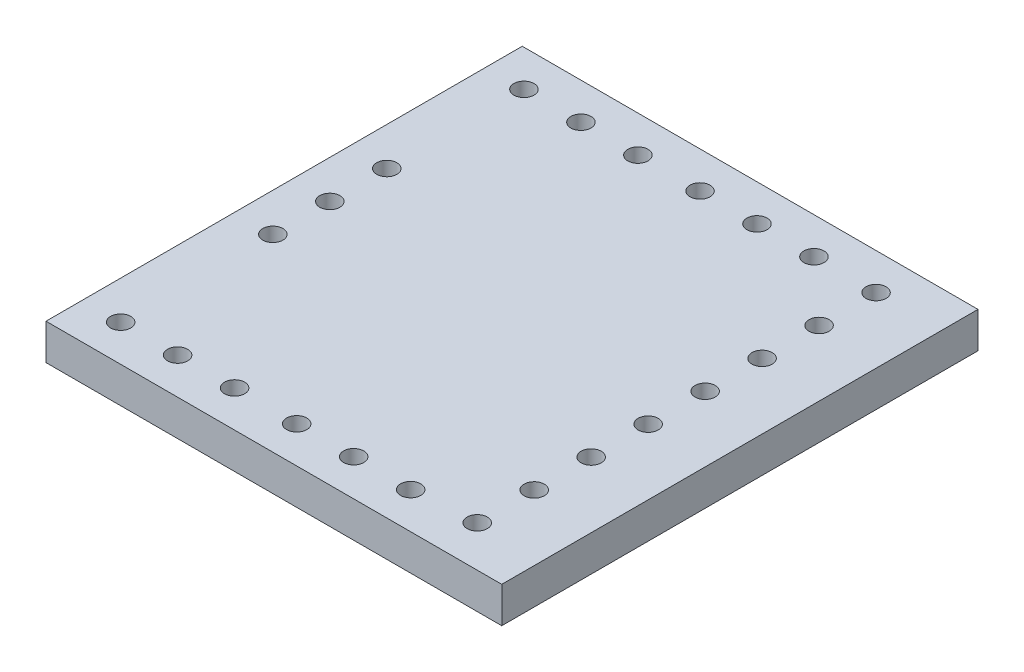
ISO-10303-21;
HEADER;
FILE_DESCRIPTION(('STEP AP214'),'2;1');
FILE_NAME('part.step','',(''),(''),'','','');
FILE_SCHEMA(('AUTOMOTIVE_DESIGN { 1 0 10303 214 1 1 1 1 }'));
ENDSEC;
DATA;
#1=APPLICATION_CONTEXT('core data for automotive mechanical design processes');
#2=APPLICATION_PROTOCOL_DEFINITION('international standard','automotive_design',2000,#1);
#3=PRODUCT_CONTEXT('',#1,'mechanical');
#4=PRODUCT('Part','Part','',(#3));
#5=PRODUCT_RELATED_PRODUCT_CATEGORY('part','',(#4));
#6=PRODUCT_DEFINITION_FORMATION('','',#4);
#7=PRODUCT_DEFINITION_CONTEXT('part definition',#1,'design');
#8=PRODUCT_DEFINITION('design','',#6,#7);
#9=PRODUCT_DEFINITION_SHAPE('','',#8);
#10=(LENGTH_UNIT() NAMED_UNIT(*) SI_UNIT(.MILLI.,.METRE.));
#11=(NAMED_UNIT(*) PLANE_ANGLE_UNIT() SI_UNIT($,.RADIAN.));
#12=(NAMED_UNIT(*) SI_UNIT($,.STERADIAN.) SOLID_ANGLE_UNIT());
#13=UNCERTAINTY_MEASURE_WITH_UNIT(LENGTH_MEASURE(1.E-05),#10,'distance_accuracy_value','');
#14=(GEOMETRIC_REPRESENTATION_CONTEXT(3) GLOBAL_UNCERTAINTY_ASSIGNED_CONTEXT((#13)) GLOBAL_UNIT_ASSIGNED_CONTEXT((#10,
#11,#12)) REPRESENTATION_CONTEXT('',''));
#15=CARTESIAN_POINT('',(0.,0.,0.));
#16=DIRECTION('',(0.,0.,1.));
#17=DIRECTION('',(1.,0.,0.));
#18=AXIS2_PLACEMENT_3D('',#15,#16,#17);
#19=CARTESIAN_POINT('',(10.16,1.6,-10.617));
#20=DIRECTION('',(-1.,0.,0.));
#21=DIRECTION('',(0.,0.,1.));
#22=AXIS2_PLACEMENT_3D('',#19,#20,#21);
#23=PLANE('',#22);
#24=DIRECTION('',(0.,0.,-1.));
#25=VECTOR('',#24,1.);
#26=CARTESIAN_POINT('',(10.16,0.,-10.617));
#27=LINE('',#26,#25);
#28=CARTESIAN_POINT('',(10.16,0.,10.617));
#29=VERTEX_POINT('',#28);
#30=CARTESIAN_POINT('',(10.16,0.,-10.617));
#31=VERTEX_POINT('',#30);
#32=EDGE_CURVE('E98',#29,#31,#27,.T.);
#33=ORIENTED_EDGE('',*,*,#32,.T.);
#34=DIRECTION('',(0.,-1.,0.));
#35=VECTOR('',#34,1.);
#36=CARTESIAN_POINT('',(10.16,1.6,-10.617));
#37=LINE('',#36,#35);
#38=CARTESIAN_POINT('',(10.16,1.6,-10.617));
#39=VERTEX_POINT('',#38);
#40=EDGE_CURVE('E11',#39,#31,#37,.T.);
#41=ORIENTED_EDGE('',*,*,#40,.F.);
#42=DIRECTION('',(0.,0.,-1.));
#43=VECTOR('',#42,1.);
#44=CARTESIAN_POINT('',(10.16,1.6,-10.617));
#45=LINE('',#44,#43);
#46=CARTESIAN_POINT('',(10.16,1.6,10.617));
#47=VERTEX_POINT('',#46);
#48=EDGE_CURVE('E86',#47,#39,#45,.T.);
#49=ORIENTED_EDGE('',*,*,#48,.F.);
#50=DIRECTION('',(0.,-1.,0.));
#51=VECTOR('',#50,1.);
#52=CARTESIAN_POINT('',(10.16,1.6,10.617));
#53=LINE('',#52,#51);
#54=EDGE_CURVE('E94',#47,#29,#53,.T.);
#55=ORIENTED_EDGE('',*,*,#54,.T.);
#56=EDGE_LOOP('',(#33,#41,#49,#55));
#57=FACE_BOUND('',#56,.T.);
#58=ADVANCED_FACE('F35',(#57),#23,.F.);
#59=CARTESIAN_POINT('',(-10.16,1.6,-10.617));
#60=DIRECTION('',(0.,0.,1.));
#61=DIRECTION('',(1.,0.,0.));
#62=AXIS2_PLACEMENT_3D('',#59,#60,#61);
#63=PLANE('',#62);
#64=DIRECTION('',(-1.,0.,0.));
#65=VECTOR('',#64,1.);
#66=CARTESIAN_POINT('',(-10.16,0.,-10.617));
#67=LINE('',#66,#65);
#68=CARTESIAN_POINT('',(-10.16,0.,-10.617));
#69=VERTEX_POINT('',#68);
#70=EDGE_CURVE('E90',#31,#69,#67,.T.);
#71=ORIENTED_EDGE('',*,*,#70,.T.);
#72=DIRECTION('',(0.,-1.,0.));
#73=VECTOR('',#72,1.);
#74=CARTESIAN_POINT('',(-10.16,1.6,-10.617));
#75=LINE('',#74,#73);
#76=CARTESIAN_POINT('',(-10.16,1.6,-10.617));
#77=VERTEX_POINT('',#76);
#78=EDGE_CURVE('E43',#77,#69,#75,.T.);
#79=ORIENTED_EDGE('',*,*,#78,.F.);
#80=DIRECTION('',(-1.,0.,0.));
#81=VECTOR('',#80,1.);
#82=CARTESIAN_POINT('',(-10.16,1.6,-10.617));
#83=LINE('',#82,#81);
#84=EDGE_CURVE('E81',#39,#77,#83,.T.);
#85=ORIENTED_EDGE('',*,*,#84,.F.);
#86=ORIENTED_EDGE('',*,*,#40,.T.);
#87=EDGE_LOOP('',(#71,#79,#85,#86));
#88=FACE_BOUND('',#87,.T.);
#89=ADVANCED_FACE('F89',(#88),#63,.F.);
#90=CARTESIAN_POINT('',(-10.16,1.6,-10.617));
#91=DIRECTION('',(1.,0.,0.));
#92=DIRECTION('',(0.,0.,-1.));
#93=AXIS2_PLACEMENT_3D('',#90,#91,#92);
#94=PLANE('',#93);
#95=DIRECTION('',(0.,0.,1.));
#96=VECTOR('',#95,1.);
#97=CARTESIAN_POINT('',(-10.16,0.,-10.617));
#98=LINE('',#97,#96);
#99=CARTESIAN_POINT('',(-10.16,0.,10.617));
#100=VERTEX_POINT('',#99);
#101=EDGE_CURVE('E68',#69,#100,#98,.T.);
#102=ORIENTED_EDGE('',*,*,#101,.T.);
#103=DIRECTION('',(0.,-1.,0.));
#104=VECTOR('',#103,1.);
#105=CARTESIAN_POINT('',(-10.16,1.6,10.617));
#106=LINE('',#105,#104);
#107=CARTESIAN_POINT('',(-10.16,1.6,10.617));
#108=VERTEX_POINT('',#107);
#109=EDGE_CURVE('E91',#108,#100,#106,.T.);
#110=ORIENTED_EDGE('',*,*,#109,.F.);
#111=DIRECTION('',(0.,0.,1.));
#112=VECTOR('',#111,1.);
#113=CARTESIAN_POINT('',(-10.16,1.6,-10.617));
#114=LINE('',#113,#112);
#115=EDGE_CURVE('E84',#77,#108,#114,.T.);
#116=ORIENTED_EDGE('',*,*,#115,.F.);
#117=ORIENTED_EDGE('',*,*,#78,.T.);
#118=EDGE_LOOP('',(#102,#110,#116,#117));
#119=FACE_BOUND('',#118,.T.);
#120=ADVANCED_FACE('F92',(#119),#94,.F.);
#121=CARTESIAN_POINT('',(-10.16,1.6,10.617));
#122=DIRECTION('',(0.,0.,-1.));
#123=DIRECTION('',(-1.,0.,0.));
#124=AXIS2_PLACEMENT_3D('',#121,#122,#123);
#125=PLANE('',#124);
#126=DIRECTION('',(1.,0.,0.));
#127=VECTOR('',#126,1.);
#128=CARTESIAN_POINT('',(-10.16,0.,10.617));
#129=LINE('',#128,#127);
#130=EDGE_CURVE('E74',#100,#29,#129,.T.);
#131=ORIENTED_EDGE('',*,*,#130,.T.);
#132=ORIENTED_EDGE('',*,*,#54,.F.);
#133=DIRECTION('',(1.,0.,0.));
#134=VECTOR('',#133,1.);
#135=CARTESIAN_POINT('',(-10.16,1.6,10.617));
#136=LINE('',#135,#134);
#137=EDGE_CURVE('E51',#108,#47,#136,.T.);
#138=ORIENTED_EDGE('',*,*,#137,.F.);
#139=ORIENTED_EDGE('',*,*,#109,.T.);
#140=EDGE_LOOP('',(#131,#132,#138,#139));
#141=FACE_BOUND('',#140,.T.);
#142=ADVANCED_FACE('F106',(#141),#125,.F.);
#143=CARTESIAN_POINT('',(0.,1.6,0.));
#144=DIRECTION('',(0.,1.,0.));
#145=DIRECTION('',(0.,0.,1.));
#146=AXIS2_PLACEMENT_3D('',#143,#144,#145);
#147=PLANE('',#146);
#148=CARTESIAN_POINT('',(-8.45699999999997,1.6,2.20500000000003));
#149=DIRECTION('',(0.,1.,0.));
#150=DIRECTION('',(0.,0.,1.));
#151=AXIS2_PLACEMENT_3D('',#148,#149,#150);
#152=CIRCLE('',#151,0.45);
#153=CARTESIAN_POINT('',(-8.45699999999997,1.6,2.65500000000003));
#154=VERTEX_POINT('',#153);
#155=EDGE_CURVE('E244',#154,#154,#152,.T.);
#156=ORIENTED_EDGE('',*,*,#155,.F.);
#157=EDGE_LOOP('',(#156));
#158=FACE_BOUND('',#157,.T.);
#159=CARTESIAN_POINT('',(-8.45699999999997,1.6,-0.334999999999974));
#160=DIRECTION('',(0.,1.,0.));
#161=DIRECTION('',(0.,0.,1.));
#162=AXIS2_PLACEMENT_3D('',#159,#160,#161);
#163=CIRCLE('',#162,0.45);
#164=CARTESIAN_POINT('',(-8.45699999999997,1.6,0.115000000000026));
#165=VERTEX_POINT('',#164);
#166=EDGE_CURVE('E238',#165,#165,#163,.T.);
#167=ORIENTED_EDGE('',*,*,#166,.F.);
#168=EDGE_LOOP('',(#167));
#169=FACE_BOUND('',#168,.T.);
#170=CARTESIAN_POINT('',(-8.45699999999997,1.6,-2.87499999999997));
#171=DIRECTION('',(0.,1.,0.));
#172=DIRECTION('',(0.,0.,1.));
#173=AXIS2_PLACEMENT_3D('',#170,#171,#172);
#174=CIRCLE('',#173,0.45);
#175=CARTESIAN_POINT('',(-8.45699999999997,1.6,-2.42499999999997));
#176=VERTEX_POINT('',#175);
#177=EDGE_CURVE('E232',#176,#176,#174,.T.);
#178=ORIENTED_EDGE('',*,*,#177,.F.);
#179=EDGE_LOOP('',(#178));
#180=FACE_BOUND('',#179,.T.);
#181=CARTESIAN_POINT('',(7.23900000000004,1.6,8.78900000000002));
#182=DIRECTION('',(0.,1.,0.));
#183=DIRECTION('',(0.,0.,1.));
#184=AXIS2_PLACEMENT_3D('',#181,#182,#183);
#185=CIRCLE('',#184,0.450000000000001);
#186=CARTESIAN_POINT('',(7.23900000000004,1.6,9.23900000000002));
#187=VERTEX_POINT('',#186);
#188=EDGE_CURVE('E226',#187,#187,#185,.T.);
#189=ORIENTED_EDGE('',*,*,#188,.F.);
#190=EDGE_LOOP('',(#189));
#191=FACE_BOUND('',#190,.T.);
#192=CARTESIAN_POINT('',(7.23900000000004,1.6,6.24900000000002));
#193=DIRECTION('',(0.,1.,0.));
#194=DIRECTION('',(0.,0.,1.));
#195=AXIS2_PLACEMENT_3D('',#192,#193,#194);
#196=CIRCLE('',#195,0.450000000000001);
#197=CARTESIAN_POINT('',(7.23900000000004,1.6,6.69900000000002));
#198=VERTEX_POINT('',#197);
#199=EDGE_CURVE('E220',#198,#198,#196,.T.);
#200=ORIENTED_EDGE('',*,*,#199,.F.);
#201=EDGE_LOOP('',(#200));
#202=FACE_BOUND('',#201,.T.);
#203=CARTESIAN_POINT('',(7.23900000000004,1.6,3.70900000000002));
#204=DIRECTION('',(0.,1.,0.));
#205=DIRECTION('',(0.,0.,1.));
#206=AXIS2_PLACEMENT_3D('',#203,#204,#205);
#207=CIRCLE('',#206,0.450000000000001);
#208=CARTESIAN_POINT('',(7.23900000000004,1.6,4.15900000000003));
#209=VERTEX_POINT('',#208);
#210=EDGE_CURVE('E214',#209,#209,#207,.T.);
#211=ORIENTED_EDGE('',*,*,#210,.F.);
#212=EDGE_LOOP('',(#211));
#213=FACE_BOUND('',#212,.T.);
#214=CARTESIAN_POINT('',(7.23900000000004,1.6,1.16900000000002));
#215=DIRECTION('',(0.,1.,0.));
#216=DIRECTION('',(0.,0.,1.));
#217=AXIS2_PLACEMENT_3D('',#214,#215,#216);
#218=CIRCLE('',#217,0.450000000000001);
#219=CARTESIAN_POINT('',(7.23900000000004,1.6,1.61900000000003));
#220=VERTEX_POINT('',#219);
#221=EDGE_CURVE('E208',#220,#220,#218,.T.);
#222=ORIENTED_EDGE('',*,*,#221,.F.);
#223=EDGE_LOOP('',(#222));
#224=FACE_BOUND('',#223,.T.);
#225=CARTESIAN_POINT('',(7.23900000000003,1.6,-1.37099999999998));
#226=DIRECTION('',(0.,1.,0.));
#227=DIRECTION('',(0.,0.,1.));
#228=AXIS2_PLACEMENT_3D('',#225,#226,#227);
#229=CIRCLE('',#228,0.450000000000001);
#230=CARTESIAN_POINT('',(7.23900000000003,1.6,-0.920999999999974));
#231=VERTEX_POINT('',#230);
#232=EDGE_CURVE('E202',#231,#231,#229,.T.);
#233=ORIENTED_EDGE('',*,*,#232,.F.);
#234=EDGE_LOOP('',(#233));
#235=FACE_BOUND('',#234,.T.);
#236=CARTESIAN_POINT('',(7.23900000000003,1.6,-3.91099999999998));
#237=DIRECTION('',(0.,1.,0.));
#238=DIRECTION('',(0.,0.,1.));
#239=AXIS2_PLACEMENT_3D('',#236,#237,#238);
#240=CIRCLE('',#239,0.450000000000001);
#241=CARTESIAN_POINT('',(7.23900000000003,1.6,-3.46099999999997));
#242=VERTEX_POINT('',#241);
#243=EDGE_CURVE('E196',#242,#242,#240,.T.);
#244=ORIENTED_EDGE('',*,*,#243,.F.);
#245=EDGE_LOOP('',(#244));
#246=FACE_BOUND('',#245,.T.);
#247=CARTESIAN_POINT('',(7.23900000000003,1.6,-6.45099999999997));
#248=DIRECTION('',(0.,1.,0.));
#249=DIRECTION('',(0.,0.,1.));
#250=AXIS2_PLACEMENT_3D('',#247,#248,#249);
#251=CIRCLE('',#250,0.450000000000001);
#252=CARTESIAN_POINT('',(7.23900000000003,1.6,-6.00099999999997));
#253=VERTEX_POINT('',#252);
#254=EDGE_CURVE('E190',#253,#253,#251,.T.);
#255=ORIENTED_EDGE('',*,*,#254,.F.);
#256=EDGE_LOOP('',(#255));
#257=FACE_BOUND('',#256,.T.);
#258=CARTESIAN_POINT('',(7.23900000000003,1.6,-8.99099999999997));
#259=DIRECTION('',(0.,1.,0.));
#260=DIRECTION('',(0.,0.,1.));
#261=AXIS2_PLACEMENT_3D('',#258,#259,#260);
#262=CIRCLE('',#261,0.450000000000001);
#263=CARTESIAN_POINT('',(7.23900000000003,1.6,-8.54099999999997));
#264=VERTEX_POINT('',#263);
#265=EDGE_CURVE('E184',#264,#264,#262,.T.);
#266=ORIENTED_EDGE('',*,*,#265,.F.);
#267=EDGE_LOOP('',(#266));
#268=FACE_BOUND('',#267,.T.);
#269=CARTESIAN_POINT('',(-8.45799999999997,1.6,8.99099999999997));
#270=DIRECTION('',(0.,1.,0.));
#271=DIRECTION('',(0.,0.,-1.));
#272=AXIS2_PLACEMENT_3D('',#269,#270,#271);
#273=CIRCLE('',#272,0.45);
#274=CARTESIAN_POINT('',(-8.45799999999997,1.6,8.54099999999997));
#275=VERTEX_POINT('',#274);
#276=EDGE_CURVE('E178',#275,#275,#273,.T.);
#277=ORIENTED_EDGE('',*,*,#276,.F.);
#278=EDGE_LOOP('',(#277));
#279=FACE_BOUND('',#278,.T.);
#280=CARTESIAN_POINT('',(-5.91799999999997,1.6,8.99099999999997));
#281=DIRECTION('',(0.,1.,0.));
#282=DIRECTION('',(0.,0.,-1.));
#283=AXIS2_PLACEMENT_3D('',#280,#281,#282);
#284=CIRCLE('',#283,0.45);
#285=CARTESIAN_POINT('',(-5.91799999999997,1.6,8.54099999999997));
#286=VERTEX_POINT('',#285);
#287=EDGE_CURVE('E172',#286,#286,#284,.T.);
#288=ORIENTED_EDGE('',*,*,#287,.F.);
#289=EDGE_LOOP('',(#288));
#290=FACE_BOUND('',#289,.T.);
#291=CARTESIAN_POINT('',(-3.37799999999997,1.6,8.99099999999997));
#292=DIRECTION('',(0.,1.,0.));
#293=DIRECTION('',(0.,0.,-1.));
#294=AXIS2_PLACEMENT_3D('',#291,#292,#293);
#295=CIRCLE('',#294,0.45);
#296=CARTESIAN_POINT('',(-3.37799999999997,1.6,8.54099999999997));
#297=VERTEX_POINT('',#296);
#298=EDGE_CURVE('E166',#297,#297,#295,.T.);
#299=ORIENTED_EDGE('',*,*,#298,.F.);
#300=EDGE_LOOP('',(#299));
#301=FACE_BOUND('',#300,.T.);
#302=CARTESIAN_POINT('',(-0.607999999999971,1.6,8.99099999999997));
#303=DIRECTION('',(0.,1.,0.));
#304=DIRECTION('',(0.,0.,-1.));
#305=AXIS2_PLACEMENT_3D('',#302,#303,#304);
#306=CIRCLE('',#305,0.45);
#307=CARTESIAN_POINT('',(-0.607999999999971,1.6,8.54099999999997));
#308=VERTEX_POINT('',#307);
#309=EDGE_CURVE('E160',#308,#308,#306,.T.);
#310=ORIENTED_EDGE('',*,*,#309,.F.);
#311=EDGE_LOOP('',(#310));
#312=FACE_BOUND('',#311,.T.);
#313=CARTESIAN_POINT('',(1.93200000000003,1.6,8.99099999999997));
#314=DIRECTION('',(0.,1.,0.));
#315=DIRECTION('',(0.,0.,-1.));
#316=AXIS2_PLACEMENT_3D('',#313,#314,#315);
#317=CIRCLE('',#316,0.45);
#318=CARTESIAN_POINT('',(1.93200000000003,1.6,8.54099999999997));
#319=VERTEX_POINT('',#318);
#320=EDGE_CURVE('E154',#319,#319,#317,.T.);
#321=ORIENTED_EDGE('',*,*,#320,.F.);
#322=EDGE_LOOP('',(#321));
#323=FACE_BOUND('',#322,.T.);
#324=CARTESIAN_POINT('',(4.47200000000003,1.6,8.99099999999997));
#325=DIRECTION('',(0.,1.,0.));
#326=DIRECTION('',(0.,0.,-1.));
#327=AXIS2_PLACEMENT_3D('',#324,#325,#326);
#328=CIRCLE('',#327,0.45);
#329=CARTESIAN_POINT('',(4.47200000000003,1.6,8.54099999999997));
#330=VERTEX_POINT('',#329);
#331=EDGE_CURVE('E148',#330,#330,#328,.T.);
#332=ORIENTED_EDGE('',*,*,#331,.F.);
#333=EDGE_LOOP('',(#332));
#334=FACE_BOUND('',#333,.T.);
#335=CARTESIAN_POINT('',(4.47200000000003,1.6,-8.99099999999997));
#336=DIRECTION('',(0.,1.,0.));
#337=DIRECTION('',(0.,0.,1.));
#338=AXIS2_PLACEMENT_3D('',#335,#336,#337);
#339=CIRCLE('',#338,0.45);
#340=CARTESIAN_POINT('',(4.47200000000003,1.6,-8.54099999999997));
#341=VERTEX_POINT('',#340);
#342=EDGE_CURVE('E142',#341,#341,#339,.T.);
#343=ORIENTED_EDGE('',*,*,#342,.F.);
#344=EDGE_LOOP('',(#343));
#345=FACE_BOUND('',#344,.T.);
#346=CARTESIAN_POINT('',(1.93200000000003,1.6,-8.99099999999997));
#347=DIRECTION('',(0.,1.,0.));
#348=DIRECTION('',(0.,0.,1.));
#349=AXIS2_PLACEMENT_3D('',#346,#347,#348);
#350=CIRCLE('',#349,0.45);
#351=CARTESIAN_POINT('',(1.93200000000003,1.6,-8.54099999999997));
#352=VERTEX_POINT('',#351);
#353=EDGE_CURVE('E136',#352,#352,#350,.T.);
#354=ORIENTED_EDGE('',*,*,#353,.F.);
#355=EDGE_LOOP('',(#354));
#356=FACE_BOUND('',#355,.T.);
#357=CARTESIAN_POINT('',(-0.607999999999971,1.6,-8.99099999999997));
#358=DIRECTION('',(0.,1.,0.));
#359=DIRECTION('',(0.,0.,1.));
#360=AXIS2_PLACEMENT_3D('',#357,#358,#359);
#361=CIRCLE('',#360,0.45);
#362=CARTESIAN_POINT('',(-0.607999999999971,1.6,-8.54099999999997));
#363=VERTEX_POINT('',#362);
#364=EDGE_CURVE('E130',#363,#363,#361,.T.);
#365=ORIENTED_EDGE('',*,*,#364,.F.);
#366=EDGE_LOOP('',(#365));
#367=FACE_BOUND('',#366,.T.);
#368=CARTESIAN_POINT('',(-3.37799999999997,1.6,-8.99099999999997));
#369=DIRECTION('',(0.,1.,0.));
#370=DIRECTION('',(0.,0.,1.));
#371=AXIS2_PLACEMENT_3D('',#368,#369,#370);
#372=CIRCLE('',#371,0.45);
#373=CARTESIAN_POINT('',(-3.37799999999997,1.6,-8.54099999999997));
#374=VERTEX_POINT('',#373);
#375=EDGE_CURVE('E124',#374,#374,#372,.T.);
#376=ORIENTED_EDGE('',*,*,#375,.F.);
#377=EDGE_LOOP('',(#376));
#378=FACE_BOUND('',#377,.T.);
#379=CARTESIAN_POINT('',(-5.91799999999997,1.6,-8.99099999999997));
#380=DIRECTION('',(0.,1.,0.));
#381=DIRECTION('',(0.,0.,1.));
#382=AXIS2_PLACEMENT_3D('',#379,#380,#381);
#383=CIRCLE('',#382,0.45);
#384=CARTESIAN_POINT('',(-5.91799999999997,1.6,-8.54099999999997));
#385=VERTEX_POINT('',#384);
#386=EDGE_CURVE('E118',#385,#385,#383,.T.);
#387=ORIENTED_EDGE('',*,*,#386,.F.);
#388=EDGE_LOOP('',(#387));
#389=FACE_BOUND('',#388,.T.);
#390=CARTESIAN_POINT('',(-8.45799999999997,1.6,-8.99099999999997));
#391=DIRECTION('',(0.,1.,0.));
#392=DIRECTION('',(0.,0.,1.));
#393=AXIS2_PLACEMENT_3D('',#390,#391,#392);
#394=CIRCLE('',#393,0.45);
#395=CARTESIAN_POINT('',(-8.45799999999997,1.6,-8.54099999999997));
#396=VERTEX_POINT('',#395);
#397=EDGE_CURVE('E112',#396,#396,#394,.T.);
#398=ORIENTED_EDGE('',*,*,#397,.F.);
#399=EDGE_LOOP('',(#398));
#400=FACE_BOUND('',#399,.T.);
#401=ORIENTED_EDGE('',*,*,#48,.T.);
#402=ORIENTED_EDGE('',*,*,#84,.T.);
#403=ORIENTED_EDGE('',*,*,#115,.T.);
#404=ORIENTED_EDGE('',*,*,#137,.T.);
#405=EDGE_LOOP('',(#401,#402,#403,#404));
#406=FACE_BOUND('',#405,.T.);
#407=ADVANCED_FACE('F82',(#158,#169,#180,#191,#202,#213,#224,#235,#246,#257,#268,#279,#290,#301,
#312,#323,#334,#345,#356,#367,#378,#389,#400,#406),#147,.T.);
#408=CARTESIAN_POINT('',(0.,0.,0.));
#409=DIRECTION('',(0.,1.,0.));
#410=DIRECTION('',(0.,0.,1.));
#411=AXIS2_PLACEMENT_3D('',#408,#409,#410);
#412=PLANE('',#411);
#413=CARTESIAN_POINT('',(-8.45699999999997,0.,2.20500000000003));
#414=DIRECTION('',(0.,1.,0.));
#415=DIRECTION('',(0.,0.,1.));
#416=AXIS2_PLACEMENT_3D('',#413,#414,#415);
#417=CIRCLE('',#416,0.45);
#418=CARTESIAN_POINT('',(-8.45699999999997,0.,2.65500000000003));
#419=VERTEX_POINT('',#418);
#420=EDGE_CURVE('E241',#419,#419,#417,.T.);
#421=ORIENTED_EDGE('',*,*,#420,.T.);
#422=EDGE_LOOP('',(#421));
#423=FACE_BOUND('',#422,.T.);
#424=CARTESIAN_POINT('',(-8.45699999999997,0.,-0.334999999999974));
#425=DIRECTION('',(0.,1.,0.));
#426=DIRECTION('',(0.,0.,1.));
#427=AXIS2_PLACEMENT_3D('',#424,#425,#426);
#428=CIRCLE('',#427,0.45);
#429=CARTESIAN_POINT('',(-8.45699999999997,0.,0.115000000000026));
#430=VERTEX_POINT('',#429);
#431=EDGE_CURVE('E235',#430,#430,#428,.T.);
#432=ORIENTED_EDGE('',*,*,#431,.T.);
#433=EDGE_LOOP('',(#432));
#434=FACE_BOUND('',#433,.T.);
#435=CARTESIAN_POINT('',(-8.45699999999997,0.,-2.87499999999997));
#436=DIRECTION('',(0.,1.,0.));
#437=DIRECTION('',(0.,0.,1.));
#438=AXIS2_PLACEMENT_3D('',#435,#436,#437);
#439=CIRCLE('',#438,0.45);
#440=CARTESIAN_POINT('',(-8.45699999999997,0.,-2.42499999999997));
#441=VERTEX_POINT('',#440);
#442=EDGE_CURVE('E229',#441,#441,#439,.T.);
#443=ORIENTED_EDGE('',*,*,#442,.T.);
#444=EDGE_LOOP('',(#443));
#445=FACE_BOUND('',#444,.T.);
#446=CARTESIAN_POINT('',(7.23900000000004,0.,8.78900000000002));
#447=DIRECTION('',(0.,1.,0.));
#448=DIRECTION('',(0.,0.,1.));
#449=AXIS2_PLACEMENT_3D('',#446,#447,#448);
#450=CIRCLE('',#449,0.450000000000001);
#451=CARTESIAN_POINT('',(7.23900000000004,0.,9.23900000000002));
#452=VERTEX_POINT('',#451);
#453=EDGE_CURVE('E223',#452,#452,#450,.T.);
#454=ORIENTED_EDGE('',*,*,#453,.T.);
#455=EDGE_LOOP('',(#454));
#456=FACE_BOUND('',#455,.T.);
#457=CARTESIAN_POINT('',(7.23900000000004,0.,6.24900000000002));
#458=DIRECTION('',(0.,1.,0.));
#459=DIRECTION('',(0.,0.,1.));
#460=AXIS2_PLACEMENT_3D('',#457,#458,#459);
#461=CIRCLE('',#460,0.450000000000001);
#462=CARTESIAN_POINT('',(7.23900000000004,0.,6.69900000000002));
#463=VERTEX_POINT('',#462);
#464=EDGE_CURVE('E217',#463,#463,#461,.T.);
#465=ORIENTED_EDGE('',*,*,#464,.T.);
#466=EDGE_LOOP('',(#465));
#467=FACE_BOUND('',#466,.T.);
#468=CARTESIAN_POINT('',(7.23900000000004,0.,3.70900000000002));
#469=DIRECTION('',(0.,1.,0.));
#470=DIRECTION('',(0.,0.,1.));
#471=AXIS2_PLACEMENT_3D('',#468,#469,#470);
#472=CIRCLE('',#471,0.450000000000001);
#473=CARTESIAN_POINT('',(7.23900000000004,0.,4.15900000000003));
#474=VERTEX_POINT('',#473);
#475=EDGE_CURVE('E211',#474,#474,#472,.T.);
#476=ORIENTED_EDGE('',*,*,#475,.T.);
#477=EDGE_LOOP('',(#476));
#478=FACE_BOUND('',#477,.T.);
#479=CARTESIAN_POINT('',(7.23900000000004,0.,1.16900000000002));
#480=DIRECTION('',(0.,1.,0.));
#481=DIRECTION('',(0.,0.,1.));
#482=AXIS2_PLACEMENT_3D('',#479,#480,#481);
#483=CIRCLE('',#482,0.450000000000001);
#484=CARTESIAN_POINT('',(7.23900000000004,0.,1.61900000000003));
#485=VERTEX_POINT('',#484);
#486=EDGE_CURVE('E205',#485,#485,#483,.T.);
#487=ORIENTED_EDGE('',*,*,#486,.T.);
#488=EDGE_LOOP('',(#487));
#489=FACE_BOUND('',#488,.T.);
#490=CARTESIAN_POINT('',(7.23900000000003,0.,-1.37099999999998));
#491=DIRECTION('',(0.,1.,0.));
#492=DIRECTION('',(0.,0.,1.));
#493=AXIS2_PLACEMENT_3D('',#490,#491,#492);
#494=CIRCLE('',#493,0.450000000000001);
#495=CARTESIAN_POINT('',(7.23900000000003,0.,-0.920999999999974));
#496=VERTEX_POINT('',#495);
#497=EDGE_CURVE('E199',#496,#496,#494,.T.);
#498=ORIENTED_EDGE('',*,*,#497,.T.);
#499=EDGE_LOOP('',(#498));
#500=FACE_BOUND('',#499,.T.);
#501=CARTESIAN_POINT('',(7.23900000000003,0.,-3.91099999999998));
#502=DIRECTION('',(0.,1.,0.));
#503=DIRECTION('',(0.,0.,1.));
#504=AXIS2_PLACEMENT_3D('',#501,#502,#503);
#505=CIRCLE('',#504,0.450000000000001);
#506=CARTESIAN_POINT('',(7.23900000000003,0.,-3.46099999999997));
#507=VERTEX_POINT('',#506);
#508=EDGE_CURVE('E193',#507,#507,#505,.T.);
#509=ORIENTED_EDGE('',*,*,#508,.T.);
#510=EDGE_LOOP('',(#509));
#511=FACE_BOUND('',#510,.T.);
#512=CARTESIAN_POINT('',(7.23900000000003,0.,-6.45099999999997));
#513=DIRECTION('',(0.,1.,0.));
#514=DIRECTION('',(0.,0.,1.));
#515=AXIS2_PLACEMENT_3D('',#512,#513,#514);
#516=CIRCLE('',#515,0.450000000000001);
#517=CARTESIAN_POINT('',(7.23900000000003,0.,-6.00099999999997));
#518=VERTEX_POINT('',#517);
#519=EDGE_CURVE('E187',#518,#518,#516,.T.);
#520=ORIENTED_EDGE('',*,*,#519,.T.);
#521=EDGE_LOOP('',(#520));
#522=FACE_BOUND('',#521,.T.);
#523=CARTESIAN_POINT('',(7.23900000000003,0.,-8.99099999999997));
#524=DIRECTION('',(0.,1.,0.));
#525=DIRECTION('',(0.,0.,1.));
#526=AXIS2_PLACEMENT_3D('',#523,#524,#525);
#527=CIRCLE('',#526,0.450000000000001);
#528=CARTESIAN_POINT('',(7.23900000000003,0.,-8.54099999999997));
#529=VERTEX_POINT('',#528);
#530=EDGE_CURVE('E181',#529,#529,#527,.T.);
#531=ORIENTED_EDGE('',*,*,#530,.T.);
#532=EDGE_LOOP('',(#531));
#533=FACE_BOUND('',#532,.T.);
#534=CARTESIAN_POINT('',(-8.45799999999997,0.,8.99099999999997));
#535=DIRECTION('',(0.,1.,0.));
#536=DIRECTION('',(0.,0.,-1.));
#537=AXIS2_PLACEMENT_3D('',#534,#535,#536);
#538=CIRCLE('',#537,0.45);
#539=CARTESIAN_POINT('',(-8.45799999999997,0.,8.54099999999997));
#540=VERTEX_POINT('',#539);
#541=EDGE_CURVE('E175',#540,#540,#538,.T.);
#542=ORIENTED_EDGE('',*,*,#541,.T.);
#543=EDGE_LOOP('',(#542));
#544=FACE_BOUND('',#543,.T.);
#545=CARTESIAN_POINT('',(-5.91799999999997,0.,8.99099999999997));
#546=DIRECTION('',(0.,1.,0.));
#547=DIRECTION('',(0.,0.,-1.));
#548=AXIS2_PLACEMENT_3D('',#545,#546,#547);
#549=CIRCLE('',#548,0.45);
#550=CARTESIAN_POINT('',(-5.91799999999997,0.,8.54099999999997));
#551=VERTEX_POINT('',#550);
#552=EDGE_CURVE('E169',#551,#551,#549,.T.);
#553=ORIENTED_EDGE('',*,*,#552,.T.);
#554=EDGE_LOOP('',(#553));
#555=FACE_BOUND('',#554,.T.);
#556=CARTESIAN_POINT('',(-3.37799999999997,0.,8.99099999999997));
#557=DIRECTION('',(0.,1.,0.));
#558=DIRECTION('',(0.,0.,-1.));
#559=AXIS2_PLACEMENT_3D('',#556,#557,#558);
#560=CIRCLE('',#559,0.45);
#561=CARTESIAN_POINT('',(-3.37799999999997,0.,8.54099999999997));
#562=VERTEX_POINT('',#561);
#563=EDGE_CURVE('E163',#562,#562,#560,.T.);
#564=ORIENTED_EDGE('',*,*,#563,.T.);
#565=EDGE_LOOP('',(#564));
#566=FACE_BOUND('',#565,.T.);
#567=CARTESIAN_POINT('',(-0.607999999999971,0.,8.99099999999997));
#568=DIRECTION('',(0.,1.,0.));
#569=DIRECTION('',(0.,0.,-1.));
#570=AXIS2_PLACEMENT_3D('',#567,#568,#569);
#571=CIRCLE('',#570,0.45);
#572=CARTESIAN_POINT('',(-0.607999999999971,0.,8.54099999999997));
#573=VERTEX_POINT('',#572);
#574=EDGE_CURVE('E157',#573,#573,#571,.T.);
#575=ORIENTED_EDGE('',*,*,#574,.T.);
#576=EDGE_LOOP('',(#575));
#577=FACE_BOUND('',#576,.T.);
#578=CARTESIAN_POINT('',(1.93200000000003,0.,8.99099999999997));
#579=DIRECTION('',(0.,1.,0.));
#580=DIRECTION('',(0.,0.,-1.));
#581=AXIS2_PLACEMENT_3D('',#578,#579,#580);
#582=CIRCLE('',#581,0.45);
#583=CARTESIAN_POINT('',(1.93200000000003,0.,8.54099999999997));
#584=VERTEX_POINT('',#583);
#585=EDGE_CURVE('E151',#584,#584,#582,.T.);
#586=ORIENTED_EDGE('',*,*,#585,.T.);
#587=EDGE_LOOP('',(#586));
#588=FACE_BOUND('',#587,.T.);
#589=CARTESIAN_POINT('',(4.47200000000003,0.,8.99099999999997));
#590=DIRECTION('',(0.,1.,0.));
#591=DIRECTION('',(0.,0.,-1.));
#592=AXIS2_PLACEMENT_3D('',#589,#590,#591);
#593=CIRCLE('',#592,0.45);
#594=CARTESIAN_POINT('',(4.47200000000003,0.,8.54099999999997));
#595=VERTEX_POINT('',#594);
#596=EDGE_CURVE('E145',#595,#595,#593,.T.);
#597=ORIENTED_EDGE('',*,*,#596,.T.);
#598=EDGE_LOOP('',(#597));
#599=FACE_BOUND('',#598,.T.);
#600=CARTESIAN_POINT('',(4.47200000000003,0.,-8.99099999999997));
#601=DIRECTION('',(0.,1.,0.));
#602=DIRECTION('',(0.,0.,1.));
#603=AXIS2_PLACEMENT_3D('',#600,#601,#602);
#604=CIRCLE('',#603,0.45);
#605=CARTESIAN_POINT('',(4.47200000000003,0.,-8.54099999999997));
#606=VERTEX_POINT('',#605);
#607=EDGE_CURVE('E139',#606,#606,#604,.T.);
#608=ORIENTED_EDGE('',*,*,#607,.T.);
#609=EDGE_LOOP('',(#608));
#610=FACE_BOUND('',#609,.T.);
#611=CARTESIAN_POINT('',(1.93200000000003,0.,-8.99099999999997));
#612=DIRECTION('',(0.,1.,0.));
#613=DIRECTION('',(0.,0.,1.));
#614=AXIS2_PLACEMENT_3D('',#611,#612,#613);
#615=CIRCLE('',#614,0.45);
#616=CARTESIAN_POINT('',(1.93200000000003,0.,-8.54099999999997));
#617=VERTEX_POINT('',#616);
#618=EDGE_CURVE('E133',#617,#617,#615,.T.);
#619=ORIENTED_EDGE('',*,*,#618,.T.);
#620=EDGE_LOOP('',(#619));
#621=FACE_BOUND('',#620,.T.);
#622=CARTESIAN_POINT('',(-0.607999999999971,0.,-8.99099999999997));
#623=DIRECTION('',(0.,1.,0.));
#624=DIRECTION('',(0.,0.,1.));
#625=AXIS2_PLACEMENT_3D('',#622,#623,#624);
#626=CIRCLE('',#625,0.45);
#627=CARTESIAN_POINT('',(-0.607999999999971,0.,-8.54099999999997));
#628=VERTEX_POINT('',#627);
#629=EDGE_CURVE('E127',#628,#628,#626,.T.);
#630=ORIENTED_EDGE('',*,*,#629,.T.);
#631=EDGE_LOOP('',(#630));
#632=FACE_BOUND('',#631,.T.);
#633=CARTESIAN_POINT('',(-3.37799999999997,0.,-8.99099999999997));
#634=DIRECTION('',(0.,1.,0.));
#635=DIRECTION('',(0.,0.,1.));
#636=AXIS2_PLACEMENT_3D('',#633,#634,#635);
#637=CIRCLE('',#636,0.45);
#638=CARTESIAN_POINT('',(-3.37799999999997,0.,-8.54099999999997));
#639=VERTEX_POINT('',#638);
#640=EDGE_CURVE('E121',#639,#639,#637,.T.);
#641=ORIENTED_EDGE('',*,*,#640,.T.);
#642=EDGE_LOOP('',(#641));
#643=FACE_BOUND('',#642,.T.);
#644=CARTESIAN_POINT('',(-5.91799999999997,0.,-8.99099999999997));
#645=DIRECTION('',(0.,1.,0.));
#646=DIRECTION('',(0.,0.,1.));
#647=AXIS2_PLACEMENT_3D('',#644,#645,#646);
#648=CIRCLE('',#647,0.45);
#649=CARTESIAN_POINT('',(-5.91799999999997,0.,-8.54099999999997));
#650=VERTEX_POINT('',#649);
#651=EDGE_CURVE('E115',#650,#650,#648,.T.);
#652=ORIENTED_EDGE('',*,*,#651,.T.);
#653=EDGE_LOOP('',(#652));
#654=FACE_BOUND('',#653,.T.);
#655=CARTESIAN_POINT('',(-8.45799999999997,0.,-8.99099999999997));
#656=DIRECTION('',(0.,1.,0.));
#657=DIRECTION('',(0.,0.,1.));
#658=AXIS2_PLACEMENT_3D('',#655,#656,#657);
#659=CIRCLE('',#658,0.45);
#660=CARTESIAN_POINT('',(-8.45799999999997,0.,-8.54099999999997));
#661=VERTEX_POINT('',#660);
#662=EDGE_CURVE('E101',#661,#661,#659,.T.);
#663=ORIENTED_EDGE('',*,*,#662,.T.);
#664=EDGE_LOOP('',(#663));
#665=FACE_BOUND('',#664,.T.);
#666=ORIENTED_EDGE('',*,*,#32,.F.);
#667=ORIENTED_EDGE('',*,*,#130,.F.);
#668=ORIENTED_EDGE('',*,*,#101,.F.);
#669=ORIENTED_EDGE('',*,*,#70,.F.);
#670=EDGE_LOOP('',(#666,#667,#668,#669));
#671=FACE_BOUND('',#670,.T.);
#672=ADVANCED_FACE('F109',(#423,#434,#445,#456,#467,#478,#489,#500,#511,#522,#533,#544,#555,
#566,#577,#588,#599,#610,#621,#632,#643,#654,#665,#671),#412,.F.);
#673=CARTESIAN_POINT('',(-8.45799999999997,0.,-8.99099999999997));
#674=DIRECTION('',(0.,1.,0.));
#675=DIRECTION('',(0.,0.,1.));
#676=AXIS2_PLACEMENT_3D('',#673,#674,#675);
#677=CYLINDRICAL_SURFACE('',#676,0.45);
#678=ORIENTED_EDGE('',*,*,#662,.F.);
#679=EDGE_LOOP('',(#678));
#680=FACE_BOUND('',#679,.T.);
#681=ORIENTED_EDGE('',*,*,#397,.T.);
#682=EDGE_LOOP('',(#681));
#683=FACE_BOUND('',#682,.T.);
#684=ADVANCED_FACE('F306',(#680,#683),#677,.F.);
#685=CARTESIAN_POINT('',(-5.91799999999997,0.,-8.99099999999997));
#686=DIRECTION('',(0.,1.,0.));
#687=DIRECTION('',(0.,0.,1.));
#688=AXIS2_PLACEMENT_3D('',#685,#686,#687);
#689=CYLINDRICAL_SURFACE('',#688,0.45);
#690=ORIENTED_EDGE('',*,*,#651,.F.);
#691=EDGE_LOOP('',(#690));
#692=FACE_BOUND('',#691,.T.);
#693=ORIENTED_EDGE('',*,*,#386,.T.);
#694=EDGE_LOOP('',(#693));
#695=FACE_BOUND('',#694,.T.);
#696=ADVANCED_FACE('F308',(#692,#695),#689,.F.);
#697=CARTESIAN_POINT('',(-3.37799999999997,0.,-8.99099999999997));
#698=DIRECTION('',(0.,1.,0.));
#699=DIRECTION('',(0.,0.,1.));
#700=AXIS2_PLACEMENT_3D('',#697,#698,#699);
#701=CYLINDRICAL_SURFACE('',#700,0.45);
#702=ORIENTED_EDGE('',*,*,#640,.F.);
#703=EDGE_LOOP('',(#702));
#704=FACE_BOUND('',#703,.T.);
#705=ORIENTED_EDGE('',*,*,#375,.T.);
#706=EDGE_LOOP('',(#705));
#707=FACE_BOUND('',#706,.T.);
#708=ADVANCED_FACE('F315',(#704,#707),#701,.F.);
#709=CARTESIAN_POINT('',(-0.607999999999971,0.,-8.99099999999997));
#710=DIRECTION('',(0.,1.,0.));
#711=DIRECTION('',(0.,0.,1.));
#712=AXIS2_PLACEMENT_3D('',#709,#710,#711);
#713=CYLINDRICAL_SURFACE('',#712,0.45);
#714=ORIENTED_EDGE('',*,*,#629,.F.);
#715=EDGE_LOOP('',(#714));
#716=FACE_BOUND('',#715,.T.);
#717=ORIENTED_EDGE('',*,*,#364,.T.);
#718=EDGE_LOOP('',(#717));
#719=FACE_BOUND('',#718,.T.);
#720=ADVANCED_FACE('F363',(#716,#719),#713,.F.);
#721=CARTESIAN_POINT('',(1.93200000000003,0.,-8.99099999999997));
#722=DIRECTION('',(0.,1.,0.));
#723=DIRECTION('',(0.,0.,1.));
#724=AXIS2_PLACEMENT_3D('',#721,#722,#723);
#725=CYLINDRICAL_SURFACE('',#724,0.45);
#726=ORIENTED_EDGE('',*,*,#618,.F.);
#727=EDGE_LOOP('',(#726));
#728=FACE_BOUND('',#727,.T.);
#729=ORIENTED_EDGE('',*,*,#353,.T.);
#730=EDGE_LOOP('',(#729));
#731=FACE_BOUND('',#730,.T.);
#732=ADVANCED_FACE('F373',(#728,#731),#725,.F.);
#733=CARTESIAN_POINT('',(4.47200000000003,0.,-8.99099999999997));
#734=DIRECTION('',(0.,1.,0.));
#735=DIRECTION('',(0.,0.,1.));
#736=AXIS2_PLACEMENT_3D('',#733,#734,#735);
#737=CYLINDRICAL_SURFACE('',#736,0.45);
#738=ORIENTED_EDGE('',*,*,#607,.F.);
#739=EDGE_LOOP('',(#738));
#740=FACE_BOUND('',#739,.T.);
#741=ORIENTED_EDGE('',*,*,#342,.T.);
#742=EDGE_LOOP('',(#741));
#743=FACE_BOUND('',#742,.T.);
#744=ADVANCED_FACE('F383',(#740,#743),#737,.F.);
#745=CARTESIAN_POINT('',(4.47200000000003,0.,8.99099999999997));
#746=DIRECTION('',(0.,1.,0.));
#747=DIRECTION('',(0.,0.,1.));
#748=AXIS2_PLACEMENT_3D('',#745,#746,#747);
#749=CYLINDRICAL_SURFACE('',#748,0.45);
#750=ORIENTED_EDGE('',*,*,#596,.F.);
#751=EDGE_LOOP('',(#750));
#752=FACE_BOUND('',#751,.T.);
#753=ORIENTED_EDGE('',*,*,#331,.T.);
#754=EDGE_LOOP('',(#753));
#755=FACE_BOUND('',#754,.T.);
#756=ADVANCED_FACE('F393',(#752,#755),#749,.F.);
#757=CARTESIAN_POINT('',(1.93200000000003,0.,8.99099999999997));
#758=DIRECTION('',(0.,1.,0.));
#759=DIRECTION('',(0.,0.,1.));
#760=AXIS2_PLACEMENT_3D('',#757,#758,#759);
#761=CYLINDRICAL_SURFACE('',#760,0.45);
#762=ORIENTED_EDGE('',*,*,#585,.F.);
#763=EDGE_LOOP('',(#762));
#764=FACE_BOUND('',#763,.T.);
#765=ORIENTED_EDGE('',*,*,#320,.T.);
#766=EDGE_LOOP('',(#765));
#767=FACE_BOUND('',#766,.T.);
#768=ADVANCED_FACE('F403',(#764,#767),#761,.F.);
#769=CARTESIAN_POINT('',(-0.607999999999971,0.,8.99099999999997));
#770=DIRECTION('',(0.,1.,0.));
#771=DIRECTION('',(0.,0.,1.));
#772=AXIS2_PLACEMENT_3D('',#769,#770,#771);
#773=CYLINDRICAL_SURFACE('',#772,0.45);
#774=ORIENTED_EDGE('',*,*,#574,.F.);
#775=EDGE_LOOP('',(#774));
#776=FACE_BOUND('',#775,.T.);
#777=ORIENTED_EDGE('',*,*,#309,.T.);
#778=EDGE_LOOP('',(#777));
#779=FACE_BOUND('',#778,.T.);
#780=ADVANCED_FACE('F413',(#776,#779),#773,.F.);
#781=CARTESIAN_POINT('',(-3.37799999999997,0.,8.99099999999997));
#782=DIRECTION('',(0.,1.,0.));
#783=DIRECTION('',(0.,0.,1.));
#784=AXIS2_PLACEMENT_3D('',#781,#782,#783);
#785=CYLINDRICAL_SURFACE('',#784,0.45);
#786=ORIENTED_EDGE('',*,*,#563,.F.);
#787=EDGE_LOOP('',(#786));
#788=FACE_BOUND('',#787,.T.);
#789=ORIENTED_EDGE('',*,*,#298,.T.);
#790=EDGE_LOOP('',(#789));
#791=FACE_BOUND('',#790,.T.);
#792=ADVANCED_FACE('F423',(#788,#791),#785,.F.);
#793=CARTESIAN_POINT('',(-5.91799999999997,0.,8.99099999999997));
#794=DIRECTION('',(0.,1.,0.));
#795=DIRECTION('',(0.,0.,1.));
#796=AXIS2_PLACEMENT_3D('',#793,#794,#795);
#797=CYLINDRICAL_SURFACE('',#796,0.45);
#798=ORIENTED_EDGE('',*,*,#552,.F.);
#799=EDGE_LOOP('',(#798));
#800=FACE_BOUND('',#799,.T.);
#801=ORIENTED_EDGE('',*,*,#287,.T.);
#802=EDGE_LOOP('',(#801));
#803=FACE_BOUND('',#802,.T.);
#804=ADVANCED_FACE('F433',(#800,#803),#797,.F.);
#805=CARTESIAN_POINT('',(-8.45799999999997,0.,8.99099999999997));
#806=DIRECTION('',(0.,1.,0.));
#807=DIRECTION('',(0.,0.,1.));
#808=AXIS2_PLACEMENT_3D('',#805,#806,#807);
#809=CYLINDRICAL_SURFACE('',#808,0.45);
#810=ORIENTED_EDGE('',*,*,#541,.F.);
#811=EDGE_LOOP('',(#810));
#812=FACE_BOUND('',#811,.T.);
#813=ORIENTED_EDGE('',*,*,#276,.T.);
#814=EDGE_LOOP('',(#813));
#815=FACE_BOUND('',#814,.T.);
#816=ADVANCED_FACE('F443',(#812,#815),#809,.F.);
#817=CARTESIAN_POINT('',(7.23900000000003,0.,-8.99099999999997));
#818=DIRECTION('',(0.,1.,0.));
#819=DIRECTION('',(0.,0.,1.));
#820=AXIS2_PLACEMENT_3D('',#817,#818,#819);
#821=CYLINDRICAL_SURFACE('',#820,0.450000000000001);
#822=ORIENTED_EDGE('',*,*,#530,.F.);
#823=EDGE_LOOP('',(#822));
#824=FACE_BOUND('',#823,.T.);
#825=ORIENTED_EDGE('',*,*,#265,.T.);
#826=EDGE_LOOP('',(#825));
#827=FACE_BOUND('',#826,.T.);
#828=ADVANCED_FACE('F453',(#824,#827),#821,.F.);
#829=CARTESIAN_POINT('',(7.23900000000003,0.,-6.45099999999997));
#830=DIRECTION('',(0.,1.,0.));
#831=DIRECTION('',(0.,0.,1.));
#832=AXIS2_PLACEMENT_3D('',#829,#830,#831);
#833=CYLINDRICAL_SURFACE('',#832,0.450000000000001);
#834=ORIENTED_EDGE('',*,*,#519,.F.);
#835=EDGE_LOOP('',(#834));
#836=FACE_BOUND('',#835,.T.);
#837=ORIENTED_EDGE('',*,*,#254,.T.);
#838=EDGE_LOOP('',(#837));
#839=FACE_BOUND('',#838,.T.);
#840=ADVANCED_FACE('F463',(#836,#839),#833,.F.);
#841=CARTESIAN_POINT('',(7.23900000000003,0.,-3.91099999999998));
#842=DIRECTION('',(0.,1.,0.));
#843=DIRECTION('',(0.,0.,1.));
#844=AXIS2_PLACEMENT_3D('',#841,#842,#843);
#845=CYLINDRICAL_SURFACE('',#844,0.450000000000001);
#846=ORIENTED_EDGE('',*,*,#508,.F.);
#847=EDGE_LOOP('',(#846));
#848=FACE_BOUND('',#847,.T.);
#849=ORIENTED_EDGE('',*,*,#243,.T.);
#850=EDGE_LOOP('',(#849));
#851=FACE_BOUND('',#850,.T.);
#852=ADVANCED_FACE('F473',(#848,#851),#845,.F.);
#853=CARTESIAN_POINT('',(7.23900000000003,0.,-1.37099999999998));
#854=DIRECTION('',(0.,1.,0.));
#855=DIRECTION('',(0.,0.,1.));
#856=AXIS2_PLACEMENT_3D('',#853,#854,#855);
#857=CYLINDRICAL_SURFACE('',#856,0.450000000000001);
#858=ORIENTED_EDGE('',*,*,#497,.F.);
#859=EDGE_LOOP('',(#858));
#860=FACE_BOUND('',#859,.T.);
#861=ORIENTED_EDGE('',*,*,#232,.T.);
#862=EDGE_LOOP('',(#861));
#863=FACE_BOUND('',#862,.T.);
#864=ADVANCED_FACE('F483',(#860,#863),#857,.F.);
#865=CARTESIAN_POINT('',(7.23900000000004,0.,1.16900000000002));
#866=DIRECTION('',(0.,1.,0.));
#867=DIRECTION('',(0.,0.,1.));
#868=AXIS2_PLACEMENT_3D('',#865,#866,#867);
#869=CYLINDRICAL_SURFACE('',#868,0.450000000000001);
#870=ORIENTED_EDGE('',*,*,#486,.F.);
#871=EDGE_LOOP('',(#870));
#872=FACE_BOUND('',#871,.T.);
#873=ORIENTED_EDGE('',*,*,#221,.T.);
#874=EDGE_LOOP('',(#873));
#875=FACE_BOUND('',#874,.T.);
#876=ADVANCED_FACE('F493',(#872,#875),#869,.F.);
#877=CARTESIAN_POINT('',(7.23900000000004,0.,3.70900000000002));
#878=DIRECTION('',(0.,1.,0.));
#879=DIRECTION('',(0.,0.,1.));
#880=AXIS2_PLACEMENT_3D('',#877,#878,#879);
#881=CYLINDRICAL_SURFACE('',#880,0.450000000000001);
#882=ORIENTED_EDGE('',*,*,#475,.F.);
#883=EDGE_LOOP('',(#882));
#884=FACE_BOUND('',#883,.T.);
#885=ORIENTED_EDGE('',*,*,#210,.T.);
#886=EDGE_LOOP('',(#885));
#887=FACE_BOUND('',#886,.T.);
#888=ADVANCED_FACE('F503',(#884,#887),#881,.F.);
#889=CARTESIAN_POINT('',(7.23900000000004,0.,6.24900000000002));
#890=DIRECTION('',(0.,1.,0.));
#891=DIRECTION('',(0.,0.,1.));
#892=AXIS2_PLACEMENT_3D('',#889,#890,#891);
#893=CYLINDRICAL_SURFACE('',#892,0.450000000000001);
#894=ORIENTED_EDGE('',*,*,#464,.F.);
#895=EDGE_LOOP('',(#894));
#896=FACE_BOUND('',#895,.T.);
#897=ORIENTED_EDGE('',*,*,#199,.T.);
#898=EDGE_LOOP('',(#897));
#899=FACE_BOUND('',#898,.T.);
#900=ADVANCED_FACE('F513',(#896,#899),#893,.F.);
#901=CARTESIAN_POINT('',(7.23900000000004,0.,8.78900000000002));
#902=DIRECTION('',(0.,1.,0.));
#903=DIRECTION('',(0.,0.,1.));
#904=AXIS2_PLACEMENT_3D('',#901,#902,#903);
#905=CYLINDRICAL_SURFACE('',#904,0.450000000000001);
#906=ORIENTED_EDGE('',*,*,#453,.F.);
#907=EDGE_LOOP('',(#906));
#908=FACE_BOUND('',#907,.T.);
#909=ORIENTED_EDGE('',*,*,#188,.T.);
#910=EDGE_LOOP('',(#909));
#911=FACE_BOUND('',#910,.T.);
#912=ADVANCED_FACE('F523',(#908,#911),#905,.F.);
#913=CARTESIAN_POINT('',(-8.45699999999997,0.,-2.87499999999997));
#914=DIRECTION('',(0.,1.,0.));
#915=DIRECTION('',(0.,0.,1.));
#916=AXIS2_PLACEMENT_3D('',#913,#914,#915);
#917=CYLINDRICAL_SURFACE('',#916,0.45);
#918=ORIENTED_EDGE('',*,*,#442,.F.);
#919=EDGE_LOOP('',(#918));
#920=FACE_BOUND('',#919,.T.);
#921=ORIENTED_EDGE('',*,*,#177,.T.);
#922=EDGE_LOOP('',(#921));
#923=FACE_BOUND('',#922,.T.);
#924=ADVANCED_FACE('F533',(#920,#923),#917,.F.);
#925=CARTESIAN_POINT('',(-8.45699999999997,0.,-0.334999999999974));
#926=DIRECTION('',(0.,1.,0.));
#927=DIRECTION('',(0.,0.,1.));
#928=AXIS2_PLACEMENT_3D('',#925,#926,#927);
#929=CYLINDRICAL_SURFACE('',#928,0.45);
#930=ORIENTED_EDGE('',*,*,#431,.F.);
#931=EDGE_LOOP('',(#930));
#932=FACE_BOUND('',#931,.T.);
#933=ORIENTED_EDGE('',*,*,#166,.T.);
#934=EDGE_LOOP('',(#933));
#935=FACE_BOUND('',#934,.T.);
#936=ADVANCED_FACE('F255',(#932,#935),#929,.F.);
#937=CARTESIAN_POINT('',(-8.45699999999997,0.,2.20500000000003));
#938=DIRECTION('',(0.,1.,0.));
#939=DIRECTION('',(0.,0.,1.));
#940=AXIS2_PLACEMENT_3D('',#937,#938,#939);
#941=CYLINDRICAL_SURFACE('',#940,0.45);
#942=ORIENTED_EDGE('',*,*,#420,.F.);
#943=EDGE_LOOP('',(#942));
#944=FACE_BOUND('',#943,.T.);
#945=ORIENTED_EDGE('',*,*,#155,.T.);
#946=EDGE_LOOP('',(#945));
#947=FACE_BOUND('',#946,.T.);
#948=ADVANCED_FACE('F252',(#944,#947),#941,.F.);
#949=CLOSED_SHELL('',(#58,#89,#120,#142,#407,#672,#684,#696,#708,#720,#732,#744,#756,#768,#780,
#792,#804,#816,#828,#840,#852,#864,#876,#888,#900,#912,#924,#936,#948));
#950=MANIFOLD_SOLID_BREP('B2',#949);
#951=ADVANCED_BREP_SHAPE_REPRESENTATION('',(#18,#950),#14);
#952=SHAPE_DEFINITION_REPRESENTATION(#9,#951);
ENDSEC;
END-ISO-10303-21;
